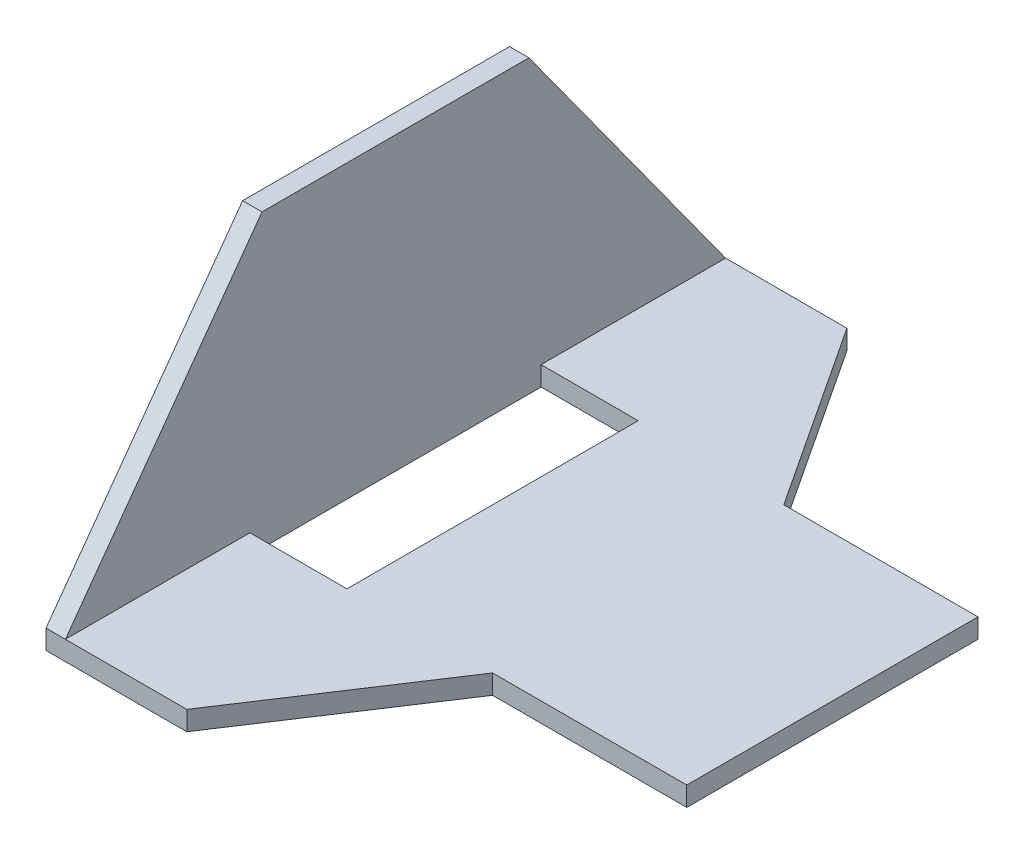
ISO-10303-21;
HEADER;
FILE_DESCRIPTION(('STEP AP214'),'2;1');
FILE_NAME('part.step','',(''),(''),'','','');
FILE_SCHEMA(('AUTOMOTIVE_DESIGN { 1 0 10303 214 1 1 1 1 }'));
ENDSEC;
DATA;
#1=APPLICATION_CONTEXT('core data for automotive mechanical design processes');
#2=APPLICATION_PROTOCOL_DEFINITION('international standard','automotive_design',2000,#1);
#3=PRODUCT_CONTEXT('',#1,'mechanical');
#4=PRODUCT('Part','Part','',(#3));
#5=PRODUCT_RELATED_PRODUCT_CATEGORY('part','',(#4));
#6=PRODUCT_DEFINITION_FORMATION('','',#4);
#7=PRODUCT_DEFINITION_CONTEXT('part definition',#1,'design');
#8=PRODUCT_DEFINITION('design','',#6,#7);
#9=PRODUCT_DEFINITION_SHAPE('','',#8);
#10=(LENGTH_UNIT() NAMED_UNIT(*) SI_UNIT(.MILLI.,.METRE.));
#11=(NAMED_UNIT(*) PLANE_ANGLE_UNIT() SI_UNIT($,.RADIAN.));
#12=(NAMED_UNIT(*) SI_UNIT($,.STERADIAN.) SOLID_ANGLE_UNIT());
#13=UNCERTAINTY_MEASURE_WITH_UNIT(LENGTH_MEASURE(1.E-05),#10,'distance_accuracy_value','');
#14=(GEOMETRIC_REPRESENTATION_CONTEXT(3) GLOBAL_UNCERTAINTY_ASSIGNED_CONTEXT((#13)) GLOBAL_UNIT_ASSIGNED_CONTEXT((#10,
#11,#12)) REPRESENTATION_CONTEXT('',''));
#15=CARTESIAN_POINT('',(0.,0.,0.));
#16=DIRECTION('',(0.,0.,1.));
#17=DIRECTION('',(1.,0.,0.));
#18=AXIS2_PLACEMENT_3D('',#15,#16,#17);
#19=CARTESIAN_POINT('',(-15.,4.,30.));
#20=DIRECTION('',(0.,0.,-1.));
#21=DIRECTION('',(-1.,0.,0.));
#22=AXIS2_PLACEMENT_3D('',#19,#20,#21);
#23=PLANE('',#22);
#24=DIRECTION('',(1.,0.,0.));
#25=VECTOR('',#24,1.);
#26=CARTESIAN_POINT('',(-15.,0.,30.));
#27=LINE('',#26,#25);
#28=CARTESIAN_POINT('',(-15.,0.,30.));
#29=VERTEX_POINT('',#28);
#30=CARTESIAN_POINT('',(24.9999999999999,0.,30.));
#31=VERTEX_POINT('',#30);
#32=EDGE_CURVE('E151',#29,#31,#27,.T.);
#33=ORIENTED_EDGE('',*,*,#32,.T.);
#34=DIRECTION('',(0.,-1.,0.));
#35=VECTOR('',#34,1.);
#36=CARTESIAN_POINT('',(24.9999999999999,4.,30.));
#37=LINE('',#36,#35);
#38=CARTESIAN_POINT('',(24.9999999999999,4.,30.));
#39=VERTEX_POINT('',#38);
#40=EDGE_CURVE('E11',#39,#31,#37,.T.);
#41=ORIENTED_EDGE('',*,*,#40,.F.);
#42=DIRECTION('',(1.,0.,0.));
#43=VECTOR('',#42,1.);
#44=CARTESIAN_POINT('',(-15.,4.,30.));
#45=LINE('',#44,#43);
#46=CARTESIAN_POINT('',(-15.,4.,30.));
#47=VERTEX_POINT('',#46);
#48=EDGE_CURVE('E179',#47,#39,#45,.T.);
#49=ORIENTED_EDGE('',*,*,#48,.F.);
#50=DIRECTION('',(0.,-1.,0.));
#51=VECTOR('',#50,1.);
#52=CARTESIAN_POINT('',(-15.,4.,30.));
#53=LINE('',#52,#51);
#54=EDGE_CURVE('E196',#47,#29,#53,.T.);
#55=ORIENTED_EDGE('',*,*,#54,.T.);
#56=EDGE_LOOP('',(#33,#41,#49,#55));
#57=FACE_BOUND('',#56,.T.);
#58=ADVANCED_FACE('F33',(#57),#23,.F.);
#59=CARTESIAN_POINT('',(25.,4.,-30.));
#60=DIRECTION('',(-1.,0.,0.));
#61=DIRECTION('',(0.,0.,1.));
#62=AXIS2_PLACEMENT_3D('',#59,#60,#61);
#63=PLANE('',#62);
#64=DIRECTION('',(0.,0.,-1.));
#65=VECTOR('',#64,1.);
#66=CARTESIAN_POINT('',(25.,0.,-30.));
#67=LINE('',#66,#65);
#68=CARTESIAN_POINT('',(25.,0.,-30.));
#69=VERTEX_POINT('',#68);
#70=EDGE_CURVE('E199',#31,#69,#67,.T.);
#71=ORIENTED_EDGE('',*,*,#70,.T.);
#72=DIRECTION('',(0.,-1.,0.));
#73=VECTOR('',#72,1.);
#74=CARTESIAN_POINT('',(25.,4.,-30.));
#75=LINE('',#74,#73);
#76=CARTESIAN_POINT('',(25.,4.,-30.));
#77=VERTEX_POINT('',#76);
#78=EDGE_CURVE('E41',#77,#69,#75,.T.);
#79=ORIENTED_EDGE('',*,*,#78,.F.);
#80=DIRECTION('',(0.,0.,-1.));
#81=VECTOR('',#80,1.);
#82=CARTESIAN_POINT('',(25.,4.,-30.));
#83=LINE('',#82,#81);
#84=EDGE_CURVE('E96',#39,#77,#83,.T.);
#85=ORIENTED_EDGE('',*,*,#84,.F.);
#86=ORIENTED_EDGE('',*,*,#40,.T.);
#87=EDGE_LOOP('',(#71,#79,#85,#86));
#88=FACE_BOUND('',#87,.T.);
#89=ADVANCED_FACE('F305',(#88),#63,.F.);
#90=CARTESIAN_POINT('',(-15.,4.,-30.));
#91=DIRECTION('',(0.,0.,1.));
#92=DIRECTION('',(1.,0.,0.));
#93=AXIS2_PLACEMENT_3D('',#90,#91,#92);
#94=PLANE('',#93);
#95=DIRECTION('',(-1.,0.,0.));
#96=VECTOR('',#95,1.);
#97=CARTESIAN_POINT('',(-15.,0.,-30.));
#98=LINE('',#97,#96);
#99=CARTESIAN_POINT('',(-15.,0.,-30.));
#100=VERTEX_POINT('',#99);
#101=EDGE_CURVE('E201',#69,#100,#98,.T.);
#102=ORIENTED_EDGE('',*,*,#101,.T.);
#103=DIRECTION('',(0.,-1.,0.));
#104=VECTOR('',#103,1.);
#105=CARTESIAN_POINT('',(-15.,4.,-30.));
#106=LINE('',#105,#104);
#107=CARTESIAN_POINT('',(-15.,4.,-30.));
#108=VERTEX_POINT('',#107);
#109=EDGE_CURVE('E232',#108,#100,#106,.T.);
#110=ORIENTED_EDGE('',*,*,#109,.F.);
#111=DIRECTION('',(-1.,0.,0.));
#112=VECTOR('',#111,1.);
#113=CARTESIAN_POINT('',(-15.,4.,-30.));
#114=LINE('',#113,#112);
#115=EDGE_CURVE('E182',#77,#108,#114,.T.);
#116=ORIENTED_EDGE('',*,*,#115,.F.);
#117=ORIENTED_EDGE('',*,*,#78,.T.);
#118=EDGE_LOOP('',(#102,#110,#116,#117));
#119=FACE_BOUND('',#118,.T.);
#120=ADVANCED_FACE('F238',(#119),#94,.F.);
#121=CARTESIAN_POINT('',(-15.,4.,-30.));
#122=DIRECTION('',(-0.83541708224394,0.,0.549616501476276));
#123=DIRECTION('',(0.549616501476276,0.,0.83541708224394));
#124=AXIS2_PLACEMENT_3D('',#121,#122,#123);
#125=PLANE('',#124);
#126=DIRECTION('',(-0.549616501476276,0.,-0.83541708224394));
#127=VECTOR('',#126,1.);
#128=CARTESIAN_POINT('',(-15.,0.,-30.));
#129=LINE('',#128,#127);
#130=CARTESIAN_POINT('',(-40.,0.,-68.));
#131=VERTEX_POINT('',#130);
#132=EDGE_CURVE('E203',#100,#131,#129,.T.);
#133=ORIENTED_EDGE('',*,*,#132,.T.);
#134=DIRECTION('',(0.,-1.,0.));
#135=VECTOR('',#134,1.);
#136=CARTESIAN_POINT('',(-40.,4.,-68.));
#137=LINE('',#136,#135);
#138=CARTESIAN_POINT('',(-40.,4.,-68.));
#139=VERTEX_POINT('',#138);
#140=EDGE_CURVE('E229',#139,#131,#137,.T.);
#141=ORIENTED_EDGE('',*,*,#140,.F.);
#142=DIRECTION('',(-0.549616501476276,0.,-0.83541708224394));
#143=VECTOR('',#142,1.);
#144=CARTESIAN_POINT('',(-15.,4.,-30.));
#145=LINE('',#144,#143);
#146=EDGE_CURVE('E184',#108,#139,#145,.T.);
#147=ORIENTED_EDGE('',*,*,#146,.F.);
#148=ORIENTED_EDGE('',*,*,#109,.T.);
#149=EDGE_LOOP('',(#133,#141,#147,#148));
#150=FACE_BOUND('',#149,.T.);
#151=ADVANCED_FACE('F248',(#150),#125,.F.);
#152=CARTESIAN_POINT('',(-40.,4.,-68.));
#153=DIRECTION('',(0.,0.,1.));
#154=DIRECTION('',(1.,0.,0.));
#155=AXIS2_PLACEMENT_3D('',#152,#153,#154);
#156=PLANE('',#155);
#157=DIRECTION('',(-1.,0.,0.));
#158=VECTOR('',#157,1.);
#159=CARTESIAN_POINT('',(-40.,0.,-68.));
#160=LINE('',#159,#158);
#161=CARTESIAN_POINT('',(-69.0000000000001,0.,-68.));
#162=VERTEX_POINT('',#161);
#163=EDGE_CURVE('E205',#131,#162,#160,.T.);
#164=ORIENTED_EDGE('',*,*,#163,.T.);
#165=DIRECTION('',(0.,-1.,0.));
#166=VECTOR('',#165,1.);
#167=CARTESIAN_POINT('',(-69.0000000000001,0.,-68.));
#168=LINE('',#167,#166);
#169=CARTESIAN_POINT('',(-69.0000000000001,4.,-68.));
#170=VERTEX_POINT('',#169);
#171=EDGE_CURVE('E175',#170,#162,#168,.T.);
#172=ORIENTED_EDGE('',*,*,#171,.F.);
#173=DIRECTION('',(1.,0.,0.));
#174=VECTOR('',#173,1.);
#175=CARTESIAN_POINT('',(-69.0000000000001,4.,-68.));
#176=LINE('',#175,#174);
#177=CARTESIAN_POINT('',(-65.,4.,-68.));
#178=VERTEX_POINT('',#177);
#179=EDGE_CURVE('E171',#170,#178,#176,.T.);
#180=ORIENTED_EDGE('',*,*,#179,.T.);
#181=DIRECTION('',(-1.,0.,0.));
#182=VECTOR('',#181,1.);
#183=CARTESIAN_POINT('',(-40.,4.,-68.));
#184=LINE('',#183,#182);
#185=EDGE_CURVE('E186',#139,#178,#184,.T.);
#186=ORIENTED_EDGE('',*,*,#185,.F.);
#187=ORIENTED_EDGE('',*,*,#140,.T.);
#188=EDGE_LOOP('',(#164,#172,#180,#186,#187));
#189=FACE_BOUND('',#188,.T.);
#190=ADVANCED_FACE('F252',(#189),#156,.F.);
#191=CARTESIAN_POINT('',(-45.,4.,-30.));
#192=DIRECTION('',(0.,0.,-1.));
#193=DIRECTION('',(-1.,0.,0.));
#194=AXIS2_PLACEMENT_3D('',#191,#192,#193);
#195=PLANE('',#194);
#196=DIRECTION('',(1.,0.,0.));
#197=VECTOR('',#196,1.);
#198=CARTESIAN_POINT('',(-45.,0.,-30.));
#199=LINE('',#198,#197);
#200=CARTESIAN_POINT('',(-65.0000000000001,0.,-30.));
#201=VERTEX_POINT('',#200);
#202=CARTESIAN_POINT('',(-45.,0.,-30.));
#203=VERTEX_POINT('',#202);
#204=EDGE_CURVE('E208',#201,#203,#199,.T.);
#205=ORIENTED_EDGE('',*,*,#204,.T.);
#206=DIRECTION('',(0.,-1.,0.));
#207=VECTOR('',#206,1.);
#208=CARTESIAN_POINT('',(-45.,4.,-30.));
#209=LINE('',#208,#207);
#210=CARTESIAN_POINT('',(-45.,4.,-30.));
#211=VERTEX_POINT('',#210);
#212=EDGE_CURVE('E223',#211,#203,#209,.T.);
#213=ORIENTED_EDGE('',*,*,#212,.F.);
#214=DIRECTION('',(1.,0.,0.));
#215=VECTOR('',#214,1.);
#216=CARTESIAN_POINT('',(-45.,4.,-30.));
#217=LINE('',#216,#215);
#218=CARTESIAN_POINT('',(-65.,4.,-30.));
#219=VERTEX_POINT('',#218);
#220=EDGE_CURVE('E190',#219,#211,#217,.T.);
#221=ORIENTED_EDGE('',*,*,#220,.F.);
#222=DIRECTION('',(0.,-1.,0.));
#223=VECTOR('',#222,1.);
#224=CARTESIAN_POINT('',(-65.,4.,-30.));
#225=LINE('',#224,#223);
#226=EDGE_CURVE('E226',#219,#201,#225,.T.);
#227=ORIENTED_EDGE('',*,*,#226,.T.);
#228=EDGE_LOOP('',(#205,#213,#221,#227));
#229=FACE_BOUND('',#228,.T.);
#230=ADVANCED_FACE('F289',(#229),#195,.F.);
#231=CARTESIAN_POINT('',(-45.,4.,-30.));
#232=DIRECTION('',(1.,0.,0.));
#233=DIRECTION('',(0.,0.,-1.));
#234=AXIS2_PLACEMENT_3D('',#231,#232,#233);
#235=PLANE('',#234);
#236=DIRECTION('',(0.,0.,1.));
#237=VECTOR('',#236,1.);
#238=CARTESIAN_POINT('',(-45.,0.,-30.));
#239=LINE('',#238,#237);
#240=CARTESIAN_POINT('',(-45.,0.,30.));
#241=VERTEX_POINT('',#240);
#242=EDGE_CURVE('E210',#203,#241,#239,.T.);
#243=ORIENTED_EDGE('',*,*,#242,.T.);
#244=DIRECTION('',(0.,-1.,0.));
#245=VECTOR('',#244,1.);
#246=CARTESIAN_POINT('',(-45.,4.,30.));
#247=LINE('',#246,#245);
#248=CARTESIAN_POINT('',(-45.,4.,30.));
#249=VERTEX_POINT('',#248);
#250=EDGE_CURVE('E220',#249,#241,#247,.T.);
#251=ORIENTED_EDGE('',*,*,#250,.F.);
#252=DIRECTION('',(0.,0.,1.));
#253=VECTOR('',#252,1.);
#254=CARTESIAN_POINT('',(-45.,4.,-30.));
#255=LINE('',#254,#253);
#256=EDGE_CURVE('E192',#211,#249,#255,.T.);
#257=ORIENTED_EDGE('',*,*,#256,.F.);
#258=ORIENTED_EDGE('',*,*,#212,.T.);
#259=EDGE_LOOP('',(#243,#251,#257,#258));
#260=FACE_BOUND('',#259,.T.);
#261=ADVANCED_FACE('F295',(#260),#235,.F.);
#262=CARTESIAN_POINT('',(-45.,4.,30.));
#263=DIRECTION('',(0.,0.,1.));
#264=DIRECTION('',(1.,0.,0.));
#265=AXIS2_PLACEMENT_3D('',#262,#263,#264);
#266=PLANE('',#265);
#267=DIRECTION('',(-1.,0.,0.));
#268=VECTOR('',#267,1.);
#269=CARTESIAN_POINT('',(-45.,0.,30.));
#270=LINE('',#269,#268);
#271=CARTESIAN_POINT('',(-65.,0.,30.));
#272=VERTEX_POINT('',#271);
#273=EDGE_CURVE('E212',#241,#272,#270,.T.);
#274=ORIENTED_EDGE('',*,*,#273,.T.);
#275=DIRECTION('',(0.,-1.,0.));
#276=VECTOR('',#275,1.);
#277=CARTESIAN_POINT('',(-65.,4.,30.));
#278=LINE('',#277,#276);
#279=CARTESIAN_POINT('',(-65.,4.,30.));
#280=VERTEX_POINT('',#279);
#281=EDGE_CURVE('E218',#280,#272,#278,.T.);
#282=ORIENTED_EDGE('',*,*,#281,.F.);
#283=DIRECTION('',(-1.,0.,0.));
#284=VECTOR('',#283,1.);
#285=CARTESIAN_POINT('',(-45.,4.,30.));
#286=LINE('',#285,#284);
#287=EDGE_CURVE('E128',#249,#280,#286,.T.);
#288=ORIENTED_EDGE('',*,*,#287,.F.);
#289=ORIENTED_EDGE('',*,*,#250,.T.);
#290=EDGE_LOOP('',(#274,#282,#288,#289));
#291=FACE_BOUND('',#290,.T.);
#292=ADVANCED_FACE('F291',(#291),#266,.F.);
#293=CARTESIAN_POINT('',(-40.,4.,68.));
#294=DIRECTION('',(0.,0.,-1.));
#295=DIRECTION('',(-1.,0.,0.));
#296=AXIS2_PLACEMENT_3D('',#293,#294,#295);
#297=PLANE('',#296);
#298=DIRECTION('',(1.,0.,0.));
#299=VECTOR('',#298,1.);
#300=CARTESIAN_POINT('',(-40.,0.,68.));
#301=LINE('',#300,#299);
#302=CARTESIAN_POINT('',(-68.9999999999999,0.,68.));
#303=VERTEX_POINT('',#302);
#304=CARTESIAN_POINT('',(-40.,0.,68.));
#305=VERTEX_POINT('',#304);
#306=EDGE_CURVE('E82',#303,#305,#301,.T.);
#307=ORIENTED_EDGE('',*,*,#306,.T.);
#308=DIRECTION('',(0.,-1.,0.));
#309=VECTOR('',#308,1.);
#310=CARTESIAN_POINT('',(-40.,4.,68.));
#311=LINE('',#310,#309);
#312=CARTESIAN_POINT('',(-40.,4.,68.));
#313=VERTEX_POINT('',#312);
#314=EDGE_CURVE('E140',#313,#305,#311,.T.);
#315=ORIENTED_EDGE('',*,*,#314,.F.);
#316=DIRECTION('',(1.,0.,0.));
#317=VECTOR('',#316,1.);
#318=CARTESIAN_POINT('',(-40.,4.,68.));
#319=LINE('',#318,#317);
#320=CARTESIAN_POINT('',(-65.,4.,68.));
#321=VERTEX_POINT('',#320);
#322=EDGE_CURVE('E126',#321,#313,#319,.T.);
#323=ORIENTED_EDGE('',*,*,#322,.F.);
#324=DIRECTION('',(1.,0.,0.));
#325=VECTOR('',#324,1.);
#326=CARTESIAN_POINT('',(-68.9999999999999,4.,68.));
#327=LINE('',#326,#325);
#328=CARTESIAN_POINT('',(-68.9999999999999,4.,68.));
#329=VERTEX_POINT('',#328);
#330=EDGE_CURVE('E138',#329,#321,#327,.T.);
#331=ORIENTED_EDGE('',*,*,#330,.F.);
#332=DIRECTION('',(0.,1.,0.));
#333=VECTOR('',#332,1.);
#334=CARTESIAN_POINT('',(-68.9999999999999,4.,68.));
#335=LINE('',#334,#333);
#336=EDGE_CURVE('E315',#303,#329,#335,.T.);
#337=ORIENTED_EDGE('',*,*,#336,.F.);
#338=EDGE_LOOP('',(#307,#315,#323,#331,#337));
#339=FACE_BOUND('',#338,.T.);
#340=ADVANCED_FACE('F136',(#339),#297,.F.);
#341=CARTESIAN_POINT('',(-15.,4.,30.));
#342=DIRECTION('',(-0.835417082243941,0.,-0.549616501476276));
#343=DIRECTION('',(-0.549616501476276,0.,0.835417082243941));
#344=AXIS2_PLACEMENT_3D('',#341,#342,#343);
#345=PLANE('',#344);
#346=DIRECTION('',(0.549616501476276,0.,-0.835417082243941));
#347=VECTOR('',#346,1.);
#348=CARTESIAN_POINT('',(-15.,0.,30.));
#349=LINE('',#348,#347);
#350=EDGE_CURVE('E88',#305,#29,#349,.T.);
#351=ORIENTED_EDGE('',*,*,#350,.T.);
#352=ORIENTED_EDGE('',*,*,#54,.F.);
#353=DIRECTION('',(0.549616501476276,0.,-0.835417082243941));
#354=VECTOR('',#353,1.);
#355=CARTESIAN_POINT('',(-15.,4.,30.));
#356=LINE('',#355,#354);
#357=EDGE_CURVE('E49',#313,#47,#356,.T.);
#358=ORIENTED_EDGE('',*,*,#357,.F.);
#359=ORIENTED_EDGE('',*,*,#314,.T.);
#360=EDGE_LOOP('',(#351,#352,#358,#359));
#361=FACE_BOUND('',#360,.T.);
#362=ADVANCED_FACE('F337',(#361),#345,.F.);
#363=CARTESIAN_POINT('',(0.,4.,0.));
#364=DIRECTION('',(0.,-1.,0.));
#365=DIRECTION('',(0.,0.,-1.));
#366=AXIS2_PLACEMENT_3D('',#363,#364,#365);
#367=PLANE('',#366);
#368=ORIENTED_EDGE('',*,*,#48,.T.);
#369=ORIENTED_EDGE('',*,*,#84,.T.);
#370=ORIENTED_EDGE('',*,*,#115,.T.);
#371=ORIENTED_EDGE('',*,*,#146,.T.);
#372=ORIENTED_EDGE('',*,*,#185,.T.);
#373=DIRECTION('',(0.,0.,1.));
#374=VECTOR('',#373,1.);
#375=CARTESIAN_POINT('',(-65.,4.,-68.));
#376=LINE('',#375,#374);
#377=EDGE_CURVE('E188',#178,#219,#376,.T.);
#378=ORIENTED_EDGE('',*,*,#377,.T.);
#379=ORIENTED_EDGE('',*,*,#220,.T.);
#380=ORIENTED_EDGE('',*,*,#256,.T.);
#381=ORIENTED_EDGE('',*,*,#287,.T.);
#382=DIRECTION('',(0.,0.,1.));
#383=VECTOR('',#382,1.);
#384=CARTESIAN_POINT('',(-65.,4.,68.));
#385=LINE('',#384,#383);
#386=EDGE_CURVE('E123',#280,#321,#385,.T.);
#387=ORIENTED_EDGE('',*,*,#386,.T.);
#388=ORIENTED_EDGE('',*,*,#322,.T.);
#389=ORIENTED_EDGE('',*,*,#357,.T.);
#390=EDGE_LOOP('',(#368,#369,#370,#371,#372,#378,#379,#380,#381,#387,#388,#389));
#391=FACE_BOUND('',#390,.T.);
#392=ADVANCED_FACE('F125',(#391),#367,.F.);
#393=CARTESIAN_POINT('',(0.,0.,0.));
#394=DIRECTION('',(0.,-1.,0.));
#395=DIRECTION('',(0.,0.,-1.));
#396=AXIS2_PLACEMENT_3D('',#393,#394,#395);
#397=PLANE('',#396);
#398=ORIENTED_EDGE('',*,*,#204,.F.);
#399=DIRECTION('',(0.,0.,1.));
#400=VECTOR('',#399,1.);
#401=CARTESIAN_POINT('',(-64.9999999999999,0.,68.));
#402=LINE('',#401,#400);
#403=EDGE_CURVE('E160',#201,#272,#402,.T.);
#404=ORIENTED_EDGE('',*,*,#403,.T.);
#405=ORIENTED_EDGE('',*,*,#273,.F.);
#406=ORIENTED_EDGE('',*,*,#242,.F.);
#407=EDGE_LOOP('',(#398,#404,#405,#406));
#408=FACE_BOUND('',#407,.T.);
#409=ORIENTED_EDGE('',*,*,#32,.F.);
#410=ORIENTED_EDGE('',*,*,#350,.F.);
#411=ORIENTED_EDGE('',*,*,#306,.F.);
#412=DIRECTION('',(0.,0.,1.));
#413=VECTOR('',#412,1.);
#414=CARTESIAN_POINT('',(-68.9999999999999,0.,68.));
#415=LINE('',#414,#413);
#416=EDGE_CURVE('E170',#162,#303,#415,.T.);
#417=ORIENTED_EDGE('',*,*,#416,.F.);
#418=ORIENTED_EDGE('',*,*,#163,.F.);
#419=ORIENTED_EDGE('',*,*,#132,.F.);
#420=ORIENTED_EDGE('',*,*,#101,.F.);
#421=ORIENTED_EDGE('',*,*,#70,.F.);
#422=EDGE_LOOP('',(#409,#410,#411,#417,#418,#419,#420,#421));
#423=FACE_BOUND('',#422,.T.);
#424=ADVANCED_FACE('F243',(#408,#423),#397,.T.);
#425=CARTESIAN_POINT('',(-65.,0.,0.));
#426=DIRECTION('',(1.,0.,0.));
#427=DIRECTION('',(0.,0.,-1.));
#428=AXIS2_PLACEMENT_3D('',#425,#426,#427);
#429=PLANE('',#428);
#430=ORIENTED_EDGE('',*,*,#226,.F.);
#431=ORIENTED_EDGE('',*,*,#377,.F.);
#432=DIRECTION('',(0.,-0.810297504984843,-0.586018731283683));
#433=VECTOR('',#432,1.);
#434=CARTESIAN_POINT('',(-65.0000000000001,4.,-68.));
#435=LINE('',#434,#433);
#436=CARTESIAN_POINT('',(-65.0000000000001,60.,-27.4999999999999));
#437=VERTEX_POINT('',#436);
#438=EDGE_CURVE('E162',#437,#178,#435,.T.);
#439=ORIENTED_EDGE('',*,*,#438,.F.);
#440=DIRECTION('',(0.,0.,-1.));
#441=VECTOR('',#440,1.);
#442=CARTESIAN_POINT('',(-65.0000000000001,60.,-27.4999999999999));
#443=LINE('',#442,#441);
#444=CARTESIAN_POINT('',(-65.,60.,27.5000000000001));
#445=VERTEX_POINT('',#444);
#446=EDGE_CURVE('E159',#445,#437,#443,.T.);
#447=ORIENTED_EDGE('',*,*,#446,.F.);
#448=DIRECTION('',(0.,0.810297504984845,-0.586018731283681));
#449=VECTOR('',#448,1.);
#450=CARTESIAN_POINT('',(-65.,60.,27.5000000000001));
#451=LINE('',#450,#449);
#452=EDGE_CURVE('E147',#321,#445,#451,.T.);
#453=ORIENTED_EDGE('',*,*,#452,.F.);
#454=ORIENTED_EDGE('',*,*,#386,.F.);
#455=ORIENTED_EDGE('',*,*,#281,.T.);
#456=ORIENTED_EDGE('',*,*,#403,.F.);
#457=EDGE_LOOP('',(#430,#431,#439,#447,#453,#454,#455,#456));
#458=FACE_BOUND('',#457,.T.);
#459=ADVANCED_FACE('F156',(#458),#429,.T.);
#460=CARTESIAN_POINT('',(-69.,60.,27.5000000000001));
#461=DIRECTION('',(0.,-0.586018731283681,-0.810297504984845));
#462=DIRECTION('',(0.,0.810297504984845,-0.586018731283681));
#463=AXIS2_PLACEMENT_3D('',#460,#461,#462);
#464=PLANE('',#463);
#465=ORIENTED_EDGE('',*,*,#452,.T.);
#466=DIRECTION('',(1.,0.,0.));
#467=VECTOR('',#466,1.);
#468=CARTESIAN_POINT('',(-69.,60.,27.5000000000001));
#469=LINE('',#468,#467);
#470=CARTESIAN_POINT('',(-69.,60.,27.5000000000001));
#471=VERTEX_POINT('',#470);
#472=EDGE_CURVE('E152',#471,#445,#469,.T.);
#473=ORIENTED_EDGE('',*,*,#472,.F.);
#474=DIRECTION('',(0.,0.810297504984845,-0.586018731283681));
#475=VECTOR('',#474,1.);
#476=CARTESIAN_POINT('',(-69.,60.,27.5000000000001));
#477=LINE('',#476,#475);
#478=EDGE_CURVE('E150',#329,#471,#477,.T.);
#479=ORIENTED_EDGE('',*,*,#478,.F.);
#480=ORIENTED_EDGE('',*,*,#330,.T.);
#481=EDGE_LOOP('',(#465,#473,#479,#480));
#482=FACE_BOUND('',#481,.T.);
#483=ADVANCED_FACE('F144',(#482),#464,.F.);
#484=CARTESIAN_POINT('',(-69.0000000000001,60.,-27.4999999999999));
#485=DIRECTION('',(0.,-1.,0.));
#486=DIRECTION('',(0.,0.,-1.));
#487=AXIS2_PLACEMENT_3D('',#484,#485,#486);
#488=PLANE('',#487);
#489=ORIENTED_EDGE('',*,*,#446,.T.);
#490=DIRECTION('',(1.,0.,0.));
#491=VECTOR('',#490,1.);
#492=CARTESIAN_POINT('',(-69.0000000000001,60.,-27.4999999999999));
#493=LINE('',#492,#491);
#494=CARTESIAN_POINT('',(-69.0000000000001,60.,-27.4999999999999));
#495=VERTEX_POINT('',#494);
#496=EDGE_CURVE('E174',#495,#437,#493,.T.);
#497=ORIENTED_EDGE('',*,*,#496,.F.);
#498=DIRECTION('',(0.,0.,-1.));
#499=VECTOR('',#498,1.);
#500=CARTESIAN_POINT('',(-69.0000000000001,60.,-27.4999999999999));
#501=LINE('',#500,#499);
#502=EDGE_CURVE('E275',#471,#495,#501,.T.);
#503=ORIENTED_EDGE('',*,*,#502,.F.);
#504=ORIENTED_EDGE('',*,*,#472,.T.);
#505=EDGE_LOOP('',(#489,#497,#503,#504));
#506=FACE_BOUND('',#505,.T.);
#507=ADVANCED_FACE('F272',(#506),#488,.F.);
#508=CARTESIAN_POINT('',(-69.0000000000001,4.,-68.));
#509=DIRECTION('',(0.,-0.586018731283683,0.810297504984843));
#510=DIRECTION('',(0.,-0.810297504984843,-0.586018731283683));
#511=AXIS2_PLACEMENT_3D('',#508,#509,#510);
#512=PLANE('',#511);
#513=ORIENTED_EDGE('',*,*,#438,.T.);
#514=ORIENTED_EDGE('',*,*,#179,.F.);
#515=DIRECTION('',(0.,-0.810297504984843,-0.586018731283683));
#516=VECTOR('',#515,1.);
#517=CARTESIAN_POINT('',(-69.0000000000001,4.,-68.));
#518=LINE('',#517,#516);
#519=EDGE_CURVE('E268',#495,#170,#518,.T.);
#520=ORIENTED_EDGE('',*,*,#519,.F.);
#521=ORIENTED_EDGE('',*,*,#496,.T.);
#522=EDGE_LOOP('',(#513,#514,#520,#521));
#523=FACE_BOUND('',#522,.T.);
#524=ADVANCED_FACE('F262',(#523),#512,.F.);
#525=CARTESIAN_POINT('',(-69.,0.,0.));
#526=DIRECTION('',(1.,0.,0.));
#527=DIRECTION('',(0.,0.,-1.));
#528=AXIS2_PLACEMENT_3D('',#525,#526,#527);
#529=PLANE('',#528);
#530=ORIENTED_EDGE('',*,*,#416,.T.);
#531=ORIENTED_EDGE('',*,*,#336,.T.);
#532=ORIENTED_EDGE('',*,*,#478,.T.);
#533=ORIENTED_EDGE('',*,*,#502,.T.);
#534=ORIENTED_EDGE('',*,*,#519,.T.);
#535=ORIENTED_EDGE('',*,*,#171,.T.);
#536=EDGE_LOOP('',(#530,#531,#532,#533,#534,#535));
#537=FACE_BOUND('',#536,.T.);
#538=ADVANCED_FACE('F317',(#537),#529,.F.);
#539=CLOSED_SHELL('',(#58,#89,#120,#151,#190,#230,#261,#292,#340,#362,#392,#424,#459,#483,#507,
#524,#538));
#540=MANIFOLD_SOLID_BREP('B2',#539);
#541=ADVANCED_BREP_SHAPE_REPRESENTATION('',(#18,#540),#14);
#542=SHAPE_DEFINITION_REPRESENTATION(#9,#541);
ENDSEC;
END-ISO-10303-21;
